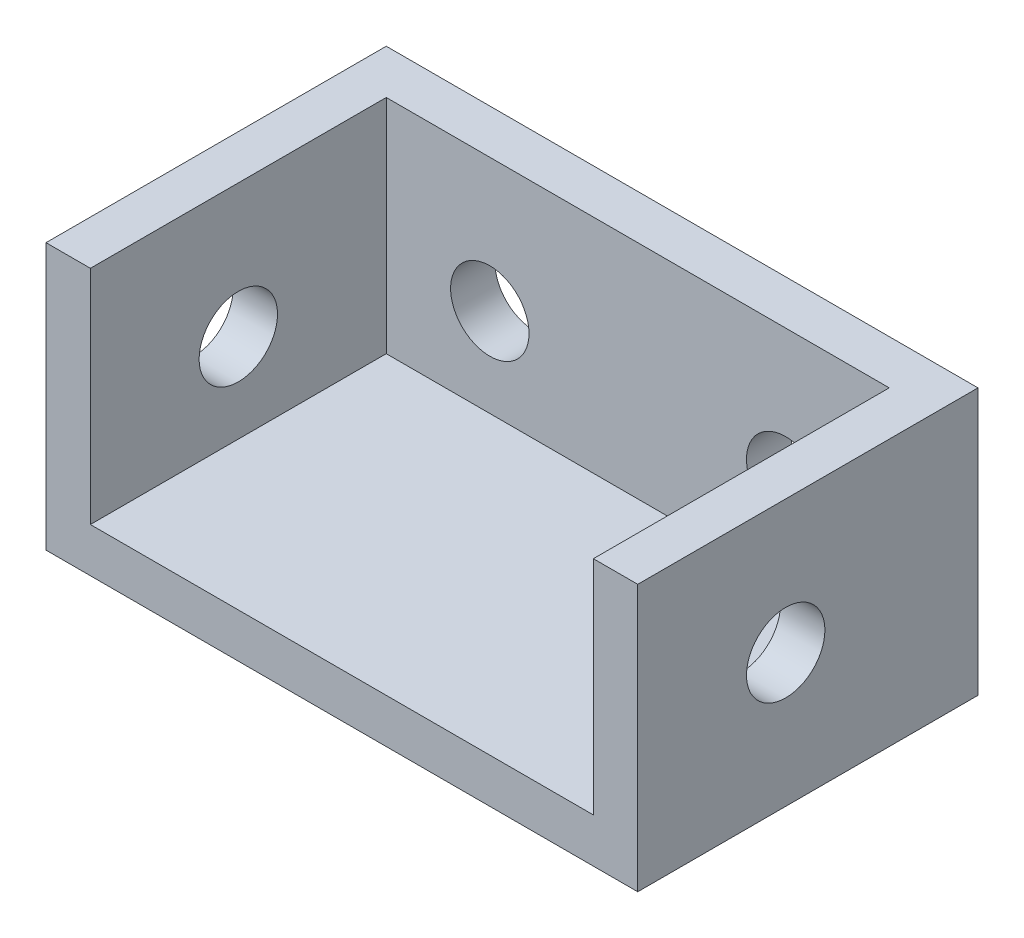
ISO-10303-21;
HEADER;
FILE_DESCRIPTION(('STEP AP214'),'2;1');
FILE_NAME('part.step','',(''),(''),'','','');
FILE_SCHEMA(('AUTOMOTIVE_DESIGN { 1 0 10303 214 1 1 1 1 }'));
ENDSEC;
DATA;
#1=APPLICATION_CONTEXT('core data for automotive mechanical design processes');
#2=APPLICATION_PROTOCOL_DEFINITION('international standard','automotive_design',2000,#1);
#3=PRODUCT_CONTEXT('',#1,'mechanical');
#4=PRODUCT('Part','Part','',(#3));
#5=PRODUCT_RELATED_PRODUCT_CATEGORY('part','',(#4));
#6=PRODUCT_DEFINITION_FORMATION('','',#4);
#7=PRODUCT_DEFINITION_CONTEXT('part definition',#1,'design');
#8=PRODUCT_DEFINITION('design','',#6,#7);
#9=PRODUCT_DEFINITION_SHAPE('','',#8);
#10=(LENGTH_UNIT() NAMED_UNIT(*) SI_UNIT(.MILLI.,.METRE.));
#11=(NAMED_UNIT(*) PLANE_ANGLE_UNIT() SI_UNIT($,.RADIAN.));
#12=(NAMED_UNIT(*) SI_UNIT($,.STERADIAN.) SOLID_ANGLE_UNIT());
#13=UNCERTAINTY_MEASURE_WITH_UNIT(LENGTH_MEASURE(1.E-05),#10,'distance_accuracy_value','');
#14=(GEOMETRIC_REPRESENTATION_CONTEXT(3) GLOBAL_UNCERTAINTY_ASSIGNED_CONTEXT((#13)) GLOBAL_UNIT_ASSIGNED_CONTEXT((#10,
#11,#12)) REPRESENTATION_CONTEXT('',''));
#15=CARTESIAN_POINT('',(0.,0.,0.));
#16=DIRECTION('',(0.,0.,1.));
#17=DIRECTION('',(1.,0.,0.));
#18=AXIS2_PLACEMENT_3D('',#15,#16,#17);
#19=CARTESIAN_POINT('',(20.,0.,13.));
#20=DIRECTION('',(-1.,0.,0.));
#21=DIRECTION('',(0.,-1.,0.));
#22=AXIS2_PLACEMENT_3D('',#19,#20,#21);
#23=CYLINDRICAL_SURFACE('',#22,2.65);
#24=CARTESIAN_POINT('',(-17.,0.,13.));
#25=DIRECTION('',(-1.,0.,0.));
#26=DIRECTION('',(0.,0.,1.));
#27=AXIS2_PLACEMENT_3D('',#24,#25,#26);
#28=CIRCLE('',#27,2.65);
#29=CARTESIAN_POINT('',(-17.,0.,15.65));
#30=VERTEX_POINT('',#29);
#31=EDGE_CURVE('E45',#30,#30,#28,.F.);
#32=ORIENTED_EDGE('',*,*,#31,.T.);
#33=EDGE_LOOP('',(#32));
#34=FACE_BOUND('',#33,.T.);
#35=CARTESIAN_POINT('',(-20.,0.,13.));
#36=DIRECTION('',(-1.,0.,0.));
#37=DIRECTION('',(0.,-1.,0.));
#38=AXIS2_PLACEMENT_3D('',#35,#36,#37);
#39=CIRCLE('',#38,2.65);
#40=CARTESIAN_POINT('',(-20.,-2.65000000000001,13.));
#41=VERTEX_POINT('',#40);
#42=EDGE_CURVE('E143',#41,#41,#39,.T.);
#43=ORIENTED_EDGE('',*,*,#42,.T.);
#44=EDGE_LOOP('',(#43));
#45=FACE_BOUND('',#44,.T.);
#46=ADVANCED_FACE('F41',(#34,#45),#23,.F.);
#47=CARTESIAN_POINT('',(0.,0.,0.));
#48=DIRECTION('',(0.,0.,1.));
#49=DIRECTION('',(1.,0.,0.));
#50=AXIS2_PLACEMENT_3D('',#47,#48,#49);
#51=PLANE('',#50);
#52=DIRECTION('',(0.,1.,0.));
#53=VECTOR('',#52,1.);
#54=CARTESIAN_POINT('',(20.,9.,0.));
#55=LINE('',#54,#53);
#56=CARTESIAN_POINT('',(20.,-9.,0.));
#57=VERTEX_POINT('',#56);
#58=CARTESIAN_POINT('',(20.,9.,0.));
#59=VERTEX_POINT('',#58);
#60=EDGE_CURVE('E167',#57,#59,#55,.T.);
#61=ORIENTED_EDGE('',*,*,#60,.F.);
#62=DIRECTION('',(1.,0.,0.));
#63=VECTOR('',#62,1.);
#64=CARTESIAN_POINT('',(-20.,-9.,0.));
#65=LINE('',#64,#63);
#66=CARTESIAN_POINT('',(-20.,-9.,0.));
#67=VERTEX_POINT('',#66);
#68=EDGE_CURVE('E66',#67,#57,#65,.T.);
#69=ORIENTED_EDGE('',*,*,#68,.F.);
#70=DIRECTION('',(0.,-1.,0.));
#71=VECTOR('',#70,1.);
#72=CARTESIAN_POINT('',(-20.,9.,0.));
#73=LINE('',#72,#71);
#74=CARTESIAN_POINT('',(-20.,9.,0.));
#75=VERTEX_POINT('',#74);
#76=EDGE_CURVE('E172',#75,#67,#73,.T.);
#77=ORIENTED_EDGE('',*,*,#76,.F.);
#78=DIRECTION('',(-1.,0.,0.));
#79=VECTOR('',#78,1.);
#80=CARTESIAN_POINT('',(-20.,9.,0.));
#81=LINE('',#80,#79);
#82=EDGE_CURVE('E170',#59,#75,#81,.T.);
#83=ORIENTED_EDGE('',*,*,#82,.F.);
#84=EDGE_LOOP('',(#61,#69,#77,#83));
#85=FACE_BOUND('',#84,.T.);
#86=CARTESIAN_POINT('',(-9.99999999999545,0.,0.));
#87=DIRECTION('',(0.,0.,1.));
#88=DIRECTION('',(1.,0.,0.));
#89=AXIS2_PLACEMENT_3D('',#86,#87,#88);
#90=CIRCLE('',#89,2.65);
#91=CARTESIAN_POINT('',(-7.34999999999545,0.,0.));
#92=VERTEX_POINT('',#91);
#93=EDGE_CURVE('E162',#92,#92,#90,.T.);
#94=ORIENTED_EDGE('',*,*,#93,.T.);
#95=EDGE_LOOP('',(#94));
#96=FACE_BOUND('',#95,.T.);
#97=CARTESIAN_POINT('',(9.99999999999545,0.,0.));
#98=DIRECTION('',(0.,0.,1.));
#99=DIRECTION('',(1.,0.,0.));
#100=AXIS2_PLACEMENT_3D('',#97,#98,#99);
#101=CIRCLE('',#100,2.65);
#102=CARTESIAN_POINT('',(12.6499999999954,0.,0.));
#103=VERTEX_POINT('',#102);
#104=EDGE_CURVE('E153',#103,#103,#101,.T.);
#105=ORIENTED_EDGE('',*,*,#104,.T.);
#106=EDGE_LOOP('',(#105));
#107=FACE_BOUND('',#106,.T.);
#108=ADVANCED_FACE('F217',(#85,#96,#107),#51,.F.);
#109=CARTESIAN_POINT('',(20.,9.,3.));
#110=DIRECTION('',(-1.,0.,0.));
#111=DIRECTION('',(0.,-1.,0.));
#112=AXIS2_PLACEMENT_3D('',#109,#110,#111);
#113=PLANE('',#112);
#114=ORIENTED_EDGE('',*,*,#60,.T.);
#115=DIRECTION('',(0.,0.,-1.));
#116=VECTOR('',#115,1.);
#117=CARTESIAN_POINT('',(20.,9.,3.));
#118=LINE('',#117,#116);
#119=CARTESIAN_POINT('',(20.,9.00000000000001,23.));
#120=VERTEX_POINT('',#119);
#121=EDGE_CURVE('E11',#120,#59,#118,.T.);
#122=ORIENTED_EDGE('',*,*,#121,.F.);
#123=DIRECTION('',(0.,1.,0.));
#124=VECTOR('',#123,1.);
#125=CARTESIAN_POINT('',(20.,9.00000000000001,23.));
#126=LINE('',#125,#124);
#127=CARTESIAN_POINT('',(20.,-8.99999999999999,23.));
#128=VERTEX_POINT('',#127);
#129=EDGE_CURVE('E147',#128,#120,#126,.T.);
#130=ORIENTED_EDGE('',*,*,#129,.F.);
#131=DIRECTION('',(0.,0.,-1.));
#132=VECTOR('',#131,1.);
#133=CARTESIAN_POINT('',(20.,-9.,3.));
#134=LINE('',#133,#132);
#135=EDGE_CURVE('E175',#128,#57,#134,.T.);
#136=ORIENTED_EDGE('',*,*,#135,.T.);
#137=EDGE_LOOP('',(#114,#122,#130,#136));
#138=FACE_BOUND('',#137,.T.);
#139=CARTESIAN_POINT('',(20.,0.,13.));
#140=DIRECTION('',(-1.,0.,0.));
#141=DIRECTION('',(0.,-1.,0.));
#142=AXIS2_PLACEMENT_3D('',#139,#140,#141);
#143=CIRCLE('',#142,2.65);
#144=CARTESIAN_POINT('',(20.,-2.65,13.));
#145=VERTEX_POINT('',#144);
#146=EDGE_CURVE('E139',#145,#145,#143,.T.);
#147=ORIENTED_EDGE('',*,*,#146,.T.);
#148=EDGE_LOOP('',(#147));
#149=FACE_BOUND('',#148,.T.);
#150=ADVANCED_FACE('F43',(#138,#149),#113,.F.);
#151=CARTESIAN_POINT('',(-20.,9.,3.));
#152=DIRECTION('',(0.,-1.,0.));
#153=DIRECTION('',(0.,0.,-1.));
#154=AXIS2_PLACEMENT_3D('',#151,#152,#153);
#155=PLANE('',#154);
#156=DIRECTION('',(-1.,0.,0.));
#157=VECTOR('',#156,1.);
#158=CARTESIAN_POINT('',(20.,9.00000000000001,23.));
#159=LINE('',#158,#157);
#160=CARTESIAN_POINT('',(-17.,9.,23.));
#161=VERTEX_POINT('',#160);
#162=CARTESIAN_POINT('',(-20.,9.,23.));
#163=VERTEX_POINT('',#162);
#164=EDGE_CURVE('E154',#161,#163,#159,.T.);
#165=ORIENTED_EDGE('',*,*,#164,.F.);
#166=DIRECTION('',(0.,0.,1.));
#167=VECTOR('',#166,1.);
#168=CARTESIAN_POINT('',(-17.,9.,23.));
#169=LINE('',#168,#167);
#170=CARTESIAN_POINT('',(-17.,9.,3.));
#171=VERTEX_POINT('',#170);
#172=EDGE_CURVE('E192',#171,#161,#169,.T.);
#173=ORIENTED_EDGE('',*,*,#172,.F.);
#174=DIRECTION('',(-1.,0.,0.));
#175=VECTOR('',#174,1.);
#176=CARTESIAN_POINT('',(-17.,9.,3.));
#177=LINE('',#176,#175);
#178=CARTESIAN_POINT('',(17.,9.,3.));
#179=VERTEX_POINT('',#178);
#180=EDGE_CURVE('E188',#179,#171,#177,.T.);
#181=ORIENTED_EDGE('',*,*,#180,.F.);
#182=DIRECTION('',(0.,0.,-1.));
#183=VECTOR('',#182,1.);
#184=CARTESIAN_POINT('',(17.,9.,23.));
#185=LINE('',#184,#183);
#186=CARTESIAN_POINT('',(17.,9.,23.));
#187=VERTEX_POINT('',#186);
#188=EDGE_CURVE('E190',#187,#179,#185,.T.);
#189=ORIENTED_EDGE('',*,*,#188,.F.);
#190=EDGE_CURVE('E131',#120,#187,#159,.T.);
#191=ORIENTED_EDGE('',*,*,#190,.F.);
#192=ORIENTED_EDGE('',*,*,#121,.T.);
#193=ORIENTED_EDGE('',*,*,#82,.T.);
#194=DIRECTION('',(0.,0.,-1.));
#195=VECTOR('',#194,1.);
#196=CARTESIAN_POINT('',(-20.,9.,3.));
#197=LINE('',#196,#195);
#198=EDGE_CURVE('E50',#163,#75,#197,.T.);
#199=ORIENTED_EDGE('',*,*,#198,.F.);
#200=EDGE_LOOP('',(#165,#173,#181,#189,#191,#192,#193,#199));
#201=FACE_BOUND('',#200,.T.);
#202=ADVANCED_FACE('F206',(#201),#155,.F.);
#203=CARTESIAN_POINT('',(-20.,9.,3.));
#204=DIRECTION('',(1.,0.,0.));
#205=DIRECTION('',(0.,1.,0.));
#206=AXIS2_PLACEMENT_3D('',#203,#204,#205);
#207=PLANE('',#206);
#208=ORIENTED_EDGE('',*,*,#76,.T.);
#209=DIRECTION('',(0.,0.,-1.));
#210=VECTOR('',#209,1.);
#211=CARTESIAN_POINT('',(-20.,-9.,3.));
#212=LINE('',#211,#210);
#213=CARTESIAN_POINT('',(-20.,-9.,23.));
#214=VERTEX_POINT('',#213);
#215=EDGE_CURVE('E177',#214,#67,#212,.T.);
#216=ORIENTED_EDGE('',*,*,#215,.F.);
#217=DIRECTION('',(0.,1.,0.));
#218=VECTOR('',#217,1.);
#219=CARTESIAN_POINT('',(-20.,9.,23.));
#220=LINE('',#219,#218);
#221=EDGE_CURVE('E142',#214,#163,#220,.T.);
#222=ORIENTED_EDGE('',*,*,#221,.T.);
#223=ORIENTED_EDGE('',*,*,#198,.T.);
#224=EDGE_LOOP('',(#208,#216,#222,#223));
#225=FACE_BOUND('',#224,.T.);
#226=ORIENTED_EDGE('',*,*,#42,.F.);
#227=EDGE_LOOP('',(#226));
#228=FACE_BOUND('',#227,.T.);
#229=ADVANCED_FACE('F209',(#225,#228),#207,.F.);
#230=CARTESIAN_POINT('',(-20.,-9.,3.));
#231=DIRECTION('',(0.,1.,0.));
#232=DIRECTION('',(0.,0.,1.));
#233=AXIS2_PLACEMENT_3D('',#230,#231,#232);
#234=PLANE('',#233);
#235=ORIENTED_EDGE('',*,*,#68,.T.);
#236=ORIENTED_EDGE('',*,*,#135,.F.);
#237=DIRECTION('',(-1.,0.,0.));
#238=VECTOR('',#237,1.);
#239=CARTESIAN_POINT('',(20.,-8.99999999999999,23.));
#240=LINE('',#239,#238);
#241=EDGE_CURVE('E149',#128,#214,#240,.T.);
#242=ORIENTED_EDGE('',*,*,#241,.T.);
#243=ORIENTED_EDGE('',*,*,#215,.T.);
#244=EDGE_LOOP('',(#235,#236,#242,#243));
#245=FACE_BOUND('',#244,.T.);
#246=ADVANCED_FACE('F219',(#245),#234,.F.);
#247=CARTESIAN_POINT('',(-9.99999999999545,0.,3.));
#248=DIRECTION('',(0.,0.,-1.));
#249=DIRECTION('',(-1.,0.,0.));
#250=AXIS2_PLACEMENT_3D('',#247,#248,#249);
#251=CYLINDRICAL_SURFACE('',#250,2.65);
#252=CARTESIAN_POINT('',(-9.99999999999545,0.,3.));
#253=DIRECTION('',(0.,0.,1.));
#254=DIRECTION('',(1.,0.,0.));
#255=AXIS2_PLACEMENT_3D('',#252,#253,#254);
#256=CIRCLE('',#255,2.65);
#257=CARTESIAN_POINT('',(-7.34999999999545,0.,3.));
#258=VERTEX_POINT('',#257);
#259=EDGE_CURVE('E159',#258,#258,#256,.T.);
#260=ORIENTED_EDGE('',*,*,#259,.T.);
#261=EDGE_LOOP('',(#260));
#262=FACE_BOUND('',#261,.T.);
#263=ORIENTED_EDGE('',*,*,#93,.F.);
#264=EDGE_LOOP('',(#263));
#265=FACE_BOUND('',#264,.T.);
#266=ADVANCED_FACE('F221',(#262,#265),#251,.F.);
#267=CARTESIAN_POINT('',(9.99999999999545,0.,3.));
#268=DIRECTION('',(0.,0.,-1.));
#269=DIRECTION('',(-1.,0.,0.));
#270=AXIS2_PLACEMENT_3D('',#267,#268,#269);
#271=CYLINDRICAL_SURFACE('',#270,2.65);
#272=CARTESIAN_POINT('',(9.99999999999545,0.,3.));
#273=DIRECTION('',(0.,0.,1.));
#274=DIRECTION('',(1.,0.,0.));
#275=AXIS2_PLACEMENT_3D('',#272,#273,#274);
#276=CIRCLE('',#275,2.65);
#277=CARTESIAN_POINT('',(12.6499999999954,0.,3.));
#278=VERTEX_POINT('',#277);
#279=EDGE_CURVE('E146',#278,#278,#276,.T.);
#280=ORIENTED_EDGE('',*,*,#279,.T.);
#281=EDGE_LOOP('',(#280));
#282=FACE_BOUND('',#281,.T.);
#283=ORIENTED_EDGE('',*,*,#104,.F.);
#284=EDGE_LOOP('',(#283));
#285=FACE_BOUND('',#284,.T.);
#286=ADVANCED_FACE('F228',(#282,#285),#271,.F.);
#287=CARTESIAN_POINT('',(20.,9.00000000000001,23.));
#288=DIRECTION('',(0.,0.,1.));
#289=DIRECTION('',(1.,0.,0.));
#290=AXIS2_PLACEMENT_3D('',#287,#288,#289);
#291=PLANE('',#290);
#292=DIRECTION('',(0.,1.,0.));
#293=VECTOR('',#292,1.);
#294=CARTESIAN_POINT('',(-17.,-6.,23.));
#295=LINE('',#294,#293);
#296=CARTESIAN_POINT('',(-17.,-6.,23.));
#297=VERTEX_POINT('',#296);
#298=EDGE_CURVE('E132',#297,#161,#295,.T.);
#299=ORIENTED_EDGE('',*,*,#298,.T.);
#300=ORIENTED_EDGE('',*,*,#164,.T.);
#301=ORIENTED_EDGE('',*,*,#221,.F.);
#302=ORIENTED_EDGE('',*,*,#241,.F.);
#303=ORIENTED_EDGE('',*,*,#129,.T.);
#304=ORIENTED_EDGE('',*,*,#190,.T.);
#305=DIRECTION('',(0.,1.,0.));
#306=VECTOR('',#305,1.);
#307=CARTESIAN_POINT('',(17.,-6.,23.));
#308=LINE('',#307,#306);
#309=CARTESIAN_POINT('',(17.,-6.,23.));
#310=VERTEX_POINT('',#309);
#311=EDGE_CURVE('E115',#310,#187,#308,.T.);
#312=ORIENTED_EDGE('',*,*,#311,.F.);
#313=DIRECTION('',(1.,0.,0.));
#314=VECTOR('',#313,1.);
#315=CARTESIAN_POINT('',(-17.,-6.,23.));
#316=LINE('',#315,#314);
#317=EDGE_CURVE('E120',#297,#310,#316,.T.);
#318=ORIENTED_EDGE('',*,*,#317,.F.);
#319=EDGE_LOOP('',(#299,#300,#301,#302,#303,#304,#312,#318));
#320=FACE_BOUND('',#319,.T.);
#321=ADVANCED_FACE('F128',(#320),#291,.T.);
#322=CARTESIAN_POINT('',(17.,0.,13.));
#323=DIRECTION('',(1.,0.,0.));
#324=DIRECTION('',(0.,0.,-1.));
#325=AXIS2_PLACEMENT_3D('',#322,#323,#324);
#326=CIRCLE('',#325,2.65);
#327=CARTESIAN_POINT('',(17.,0.,10.35));
#328=VERTEX_POINT('',#327);
#329=EDGE_CURVE('E180',#328,#328,#326,.F.);
#330=ORIENTED_EDGE('',*,*,#329,.T.);
#331=EDGE_LOOP('',(#330));
#332=FACE_BOUND('',#331,.T.);
#333=ORIENTED_EDGE('',*,*,#146,.F.);
#334=EDGE_LOOP('',(#333));
#335=FACE_BOUND('',#334,.T.);
#336=ADVANCED_FACE('F235',(#332,#335),#23,.F.);
#337=CARTESIAN_POINT('',(-17.,-6.,3.));
#338=DIRECTION('',(0.,0.,-1.));
#339=DIRECTION('',(-1.,0.,0.));
#340=AXIS2_PLACEMENT_3D('',#337,#338,#339);
#341=PLANE('',#340);
#342=ORIENTED_EDGE('',*,*,#259,.F.);
#343=EDGE_LOOP('',(#342));
#344=FACE_BOUND('',#343,.T.);
#345=ORIENTED_EDGE('',*,*,#180,.T.);
#346=DIRECTION('',(0.,1.,0.));
#347=VECTOR('',#346,1.);
#348=CARTESIAN_POINT('',(-17.,-6.,3.));
#349=LINE('',#348,#347);
#350=CARTESIAN_POINT('',(-17.,-6.,3.));
#351=VERTEX_POINT('',#350);
#352=EDGE_CURVE('E134',#351,#171,#349,.T.);
#353=ORIENTED_EDGE('',*,*,#352,.F.);
#354=DIRECTION('',(-1.,0.,0.));
#355=VECTOR('',#354,1.);
#356=CARTESIAN_POINT('',(-17.,-6.,3.));
#357=LINE('',#356,#355);
#358=CARTESIAN_POINT('',(17.,-6.,3.));
#359=VERTEX_POINT('',#358);
#360=EDGE_CURVE('E119',#359,#351,#357,.T.);
#361=ORIENTED_EDGE('',*,*,#360,.F.);
#362=DIRECTION('',(0.,1.,0.));
#363=VECTOR('',#362,1.);
#364=CARTESIAN_POINT('',(17.,-6.,3.));
#365=LINE('',#364,#363);
#366=EDGE_CURVE('E117',#359,#179,#365,.T.);
#367=ORIENTED_EDGE('',*,*,#366,.T.);
#368=EDGE_LOOP('',(#345,#353,#361,#367));
#369=FACE_BOUND('',#368,.T.);
#370=ORIENTED_EDGE('',*,*,#279,.F.);
#371=EDGE_LOOP('',(#370));
#372=FACE_BOUND('',#371,.T.);
#373=ADVANCED_FACE('F196',(#344,#369,#372),#341,.F.);
#374=CARTESIAN_POINT('',(-17.,-6.,23.));
#375=DIRECTION('',(-1.,0.,0.));
#376=DIRECTION('',(0.,0.,1.));
#377=AXIS2_PLACEMENT_3D('',#374,#375,#376);
#378=PLANE('',#377);
#379=ORIENTED_EDGE('',*,*,#172,.T.);
#380=ORIENTED_EDGE('',*,*,#298,.F.);
#381=DIRECTION('',(0.,0.,1.));
#382=VECTOR('',#381,1.);
#383=CARTESIAN_POINT('',(-17.,-6.,23.));
#384=LINE('',#383,#382);
#385=EDGE_CURVE('E58',#351,#297,#384,.T.);
#386=ORIENTED_EDGE('',*,*,#385,.F.);
#387=ORIENTED_EDGE('',*,*,#352,.T.);
#388=EDGE_LOOP('',(#379,#380,#386,#387));
#389=FACE_BOUND('',#388,.T.);
#390=ORIENTED_EDGE('',*,*,#31,.F.);
#391=EDGE_LOOP('',(#390));
#392=FACE_BOUND('',#391,.T.);
#393=ADVANCED_FACE('F200',(#389,#392),#378,.F.);
#394=CARTESIAN_POINT('',(17.,-6.,23.));
#395=DIRECTION('',(1.,0.,0.));
#396=DIRECTION('',(0.,0.,-1.));
#397=AXIS2_PLACEMENT_3D('',#394,#395,#396);
#398=PLANE('',#397);
#399=ORIENTED_EDGE('',*,*,#188,.T.);
#400=ORIENTED_EDGE('',*,*,#366,.F.);
#401=DIRECTION('',(0.,0.,-1.));
#402=VECTOR('',#401,1.);
#403=CARTESIAN_POINT('',(17.,-6.,23.));
#404=LINE('',#403,#402);
#405=EDGE_CURVE('E110',#310,#359,#404,.T.);
#406=ORIENTED_EDGE('',*,*,#405,.F.);
#407=ORIENTED_EDGE('',*,*,#311,.T.);
#408=EDGE_LOOP('',(#399,#400,#406,#407));
#409=FACE_BOUND('',#408,.T.);
#410=ORIENTED_EDGE('',*,*,#329,.F.);
#411=EDGE_LOOP('',(#410));
#412=FACE_BOUND('',#411,.T.);
#413=ADVANCED_FACE('F112',(#409,#412),#398,.F.);
#414=CARTESIAN_POINT('',(0.,-6.,0.));
#415=DIRECTION('',(0.,-1.,0.));
#416=DIRECTION('',(0.,0.,-1.));
#417=AXIS2_PLACEMENT_3D('',#414,#415,#416);
#418=PLANE('',#417);
#419=ORIENTED_EDGE('',*,*,#385,.T.);
#420=ORIENTED_EDGE('',*,*,#317,.T.);
#421=ORIENTED_EDGE('',*,*,#405,.T.);
#422=ORIENTED_EDGE('',*,*,#360,.T.);
#423=EDGE_LOOP('',(#419,#420,#421,#422));
#424=FACE_BOUND('',#423,.T.);
#425=ADVANCED_FACE('F123',(#424),#418,.F.);
#426=CLOSED_SHELL('',(#46,#108,#150,#202,#229,#246,#266,#286,#321,#336,#373,#393,#413,#425));
#427=MANIFOLD_SOLID_BREP('B2',#426);
#428=ADVANCED_BREP_SHAPE_REPRESENTATION('',(#18,#427),#14);
#429=SHAPE_DEFINITION_REPRESENTATION(#9,#428);
ENDSEC;
END-ISO-10303-21;
